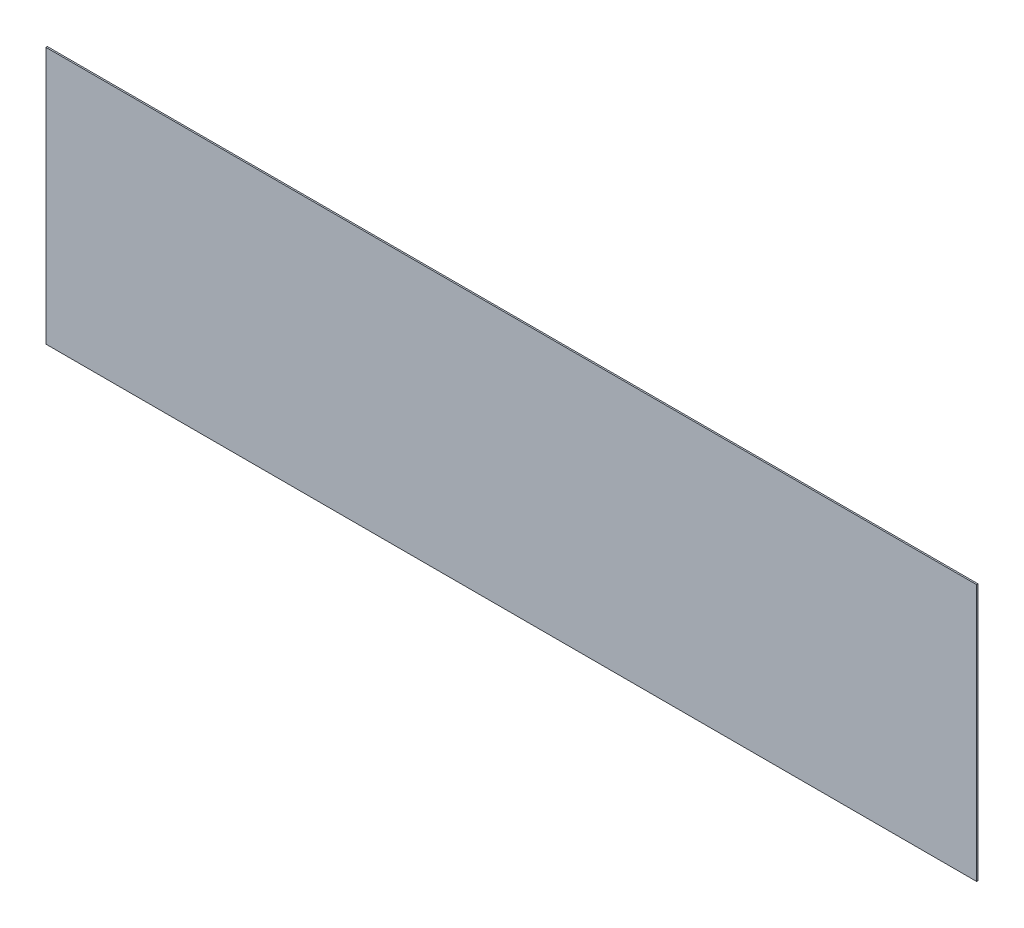
ISO-10303-21;
HEADER;
FILE_DESCRIPTION(('STEP AP214'),'2;1');
FILE_NAME('part.step','',(''),(''),'','','');
FILE_SCHEMA(('AUTOMOTIVE_DESIGN { 1 0 10303 214 1 1 1 1 }'));
ENDSEC;
DATA;
#1=APPLICATION_CONTEXT('core data for automotive mechanical design processes');
#2=APPLICATION_PROTOCOL_DEFINITION('international standard','automotive_design',2000,#1);
#3=PRODUCT_CONTEXT('',#1,'mechanical');
#4=PRODUCT('Part','Part','',(#3));
#5=PRODUCT_RELATED_PRODUCT_CATEGORY('part','',(#4));
#6=PRODUCT_DEFINITION_FORMATION('','',#4);
#7=PRODUCT_DEFINITION_CONTEXT('part definition',#1,'design');
#8=PRODUCT_DEFINITION('design','',#6,#7);
#9=PRODUCT_DEFINITION_SHAPE('','',#8);
#10=(LENGTH_UNIT() NAMED_UNIT(*) SI_UNIT(.MILLI.,.METRE.));
#11=(NAMED_UNIT(*) PLANE_ANGLE_UNIT() SI_UNIT($,.RADIAN.));
#12=(NAMED_UNIT(*) SI_UNIT($,.STERADIAN.) SOLID_ANGLE_UNIT());
#13=UNCERTAINTY_MEASURE_WITH_UNIT(LENGTH_MEASURE(1.E-05),#10,'distance_accuracy_value','');
#14=(GEOMETRIC_REPRESENTATION_CONTEXT(3) GLOBAL_UNCERTAINTY_ASSIGNED_CONTEXT((#13)) GLOBAL_UNIT_ASSIGNED_CONTEXT((#10,
#11,#12)) REPRESENTATION_CONTEXT('',''));
#15=CARTESIAN_POINT('',(0.,0.,0.));
#16=DIRECTION('',(0.,0.,1.));
#17=DIRECTION('',(1.,0.,0.));
#18=AXIS2_PLACEMENT_3D('',#15,#16,#17);
#19=CARTESIAN_POINT('',(702.,1469.,-758.5));
#20=DIRECTION('',(-1.,0.,0.));
#21=DIRECTION('',(0.,0.,1.));
#22=AXIS2_PLACEMENT_3D('',#19,#20,#21);
#23=PLANE('',#22);
#24=DIRECTION('',(0.,-1.,0.));
#25=VECTOR('',#24,1.);
#26=CARTESIAN_POINT('',(702.,1469.,-757.5));
#27=LINE('',#26,#25);
#28=CARTESIAN_POINT('',(702.,1648.,-757.5));
#29=VERTEX_POINT('',#28);
#30=CARTESIAN_POINT('',(702.,1469.,-757.5));
#31=VERTEX_POINT('',#30);
#32=EDGE_CURVE('E103',#29,#31,#27,.T.);
#33=ORIENTED_EDGE('',*,*,#32,.F.);
#34=DIRECTION('',(0.,0.,1.));
#35=VECTOR('',#34,1.);
#36=CARTESIAN_POINT('',(702.,1648.,-758.5));
#37=LINE('',#36,#35);
#38=CARTESIAN_POINT('',(702.,1648.,-758.5));
#39=VERTEX_POINT('',#38);
#40=EDGE_CURVE('E11',#39,#29,#37,.T.);
#41=ORIENTED_EDGE('',*,*,#40,.F.);
#42=DIRECTION('',(0.,-1.,0.));
#43=VECTOR('',#42,1.);
#44=CARTESIAN_POINT('',(702.,1469.,-758.5));
#45=LINE('',#44,#43);
#46=CARTESIAN_POINT('',(702.,1469.,-758.5));
#47=VERTEX_POINT('',#46);
#48=EDGE_CURVE('E97',#39,#47,#45,.T.);
#49=ORIENTED_EDGE('',*,*,#48,.T.);
#50=DIRECTION('',(0.,0.,1.));
#51=VECTOR('',#50,1.);
#52=CARTESIAN_POINT('',(702.,1469.,-758.5));
#53=LINE('',#52,#51);
#54=EDGE_CURVE('E42',#47,#31,#53,.T.);
#55=ORIENTED_EDGE('',*,*,#54,.T.);
#56=EDGE_LOOP('',(#33,#41,#49,#55));
#57=FACE_BOUND('',#56,.T.);
#58=ADVANCED_FACE('F39',(#57),#23,.T.);
#59=CARTESIAN_POINT('',(702.,1648.,-758.5));
#60=DIRECTION('',(0.,1.,0.));
#61=DIRECTION('',(0.,0.,1.));
#62=AXIS2_PLACEMENT_3D('',#59,#60,#61);
#63=PLANE('',#62);
#64=DIRECTION('',(-1.,0.,0.));
#65=VECTOR('',#64,1.);
#66=CARTESIAN_POINT('',(702.,1648.,-757.5));
#67=LINE('',#66,#65);
#68=CARTESIAN_POINT('',(1350.,1648.,-757.5));
#69=VERTEX_POINT('',#68);
#70=EDGE_CURVE('E99',#69,#29,#67,.T.);
#71=ORIENTED_EDGE('',*,*,#70,.F.);
#72=DIRECTION('',(0.,0.,1.));
#73=VECTOR('',#72,1.);
#74=CARTESIAN_POINT('',(1350.,1648.,-758.5));
#75=LINE('',#74,#73);
#76=CARTESIAN_POINT('',(1350.,1648.,-758.5));
#77=VERTEX_POINT('',#76);
#78=EDGE_CURVE('E48',#77,#69,#75,.T.);
#79=ORIENTED_EDGE('',*,*,#78,.F.);
#80=DIRECTION('',(-1.,0.,0.));
#81=VECTOR('',#80,1.);
#82=CARTESIAN_POINT('',(702.,1648.,-758.5));
#83=LINE('',#82,#81);
#84=EDGE_CURVE('E94',#77,#39,#83,.T.);
#85=ORIENTED_EDGE('',*,*,#84,.T.);
#86=ORIENTED_EDGE('',*,*,#40,.T.);
#87=EDGE_LOOP('',(#71,#79,#85,#86));
#88=FACE_BOUND('',#87,.T.);
#89=ADVANCED_FACE('F113',(#88),#63,.T.);
#90=CARTESIAN_POINT('',(1350.,1469.,-758.5));
#91=DIRECTION('',(1.,0.,0.));
#92=DIRECTION('',(0.,0.,-1.));
#93=AXIS2_PLACEMENT_3D('',#90,#91,#92);
#94=PLANE('',#93);
#95=DIRECTION('',(0.,1.,0.));
#96=VECTOR('',#95,1.);
#97=CARTESIAN_POINT('',(1350.,1469.,-757.5));
#98=LINE('',#97,#96);
#99=CARTESIAN_POINT('',(1350.,1469.,-757.5));
#100=VERTEX_POINT('',#99);
#101=EDGE_CURVE('E89',#100,#69,#98,.T.);
#102=ORIENTED_EDGE('',*,*,#101,.F.);
#103=DIRECTION('',(0.,0.,1.));
#104=VECTOR('',#103,1.);
#105=CARTESIAN_POINT('',(1350.,1469.,-758.5));
#106=LINE('',#105,#104);
#107=CARTESIAN_POINT('',(1350.,1469.,-758.5));
#108=VERTEX_POINT('',#107);
#109=EDGE_CURVE('E84',#108,#100,#106,.T.);
#110=ORIENTED_EDGE('',*,*,#109,.F.);
#111=DIRECTION('',(0.,1.,0.));
#112=VECTOR('',#111,1.);
#113=CARTESIAN_POINT('',(1350.,1469.,-758.5));
#114=LINE('',#113,#112);
#115=EDGE_CURVE('E87',#108,#77,#114,.T.);
#116=ORIENTED_EDGE('',*,*,#115,.T.);
#117=ORIENTED_EDGE('',*,*,#78,.T.);
#118=EDGE_LOOP('',(#102,#110,#116,#117));
#119=FACE_BOUND('',#118,.T.);
#120=ADVANCED_FACE('F86',(#119),#94,.T.);
#121=CARTESIAN_POINT('',(702.,1469.,-758.5));
#122=DIRECTION('',(0.,-1.,0.));
#123=DIRECTION('',(0.,0.,-1.));
#124=AXIS2_PLACEMENT_3D('',#121,#122,#123);
#125=PLANE('',#124);
#126=DIRECTION('',(1.,0.,0.));
#127=VECTOR('',#126,1.);
#128=CARTESIAN_POINT('',(702.,1469.,-757.5));
#129=LINE('',#128,#127);
#130=EDGE_CURVE('E106',#31,#100,#129,.T.);
#131=ORIENTED_EDGE('',*,*,#130,.F.);
#132=ORIENTED_EDGE('',*,*,#54,.F.);
#133=DIRECTION('',(1.,0.,0.));
#134=VECTOR('',#133,1.);
#135=CARTESIAN_POINT('',(702.,1469.,-758.5));
#136=LINE('',#135,#134);
#137=EDGE_CURVE('E93',#47,#108,#136,.T.);
#138=ORIENTED_EDGE('',*,*,#137,.T.);
#139=ORIENTED_EDGE('',*,*,#109,.T.);
#140=EDGE_LOOP('',(#131,#132,#138,#139));
#141=FACE_BOUND('',#140,.T.);
#142=ADVANCED_FACE('F96',(#141),#125,.T.);
#143=CARTESIAN_POINT('',(0.,0.,-758.5));
#144=DIRECTION('',(0.,0.,-1.));
#145=DIRECTION('',(-1.,0.,0.));
#146=AXIS2_PLACEMENT_3D('',#143,#144,#145);
#147=PLANE('',#146);
#148=ORIENTED_EDGE('',*,*,#48,.F.);
#149=ORIENTED_EDGE('',*,*,#84,.F.);
#150=ORIENTED_EDGE('',*,*,#115,.F.);
#151=ORIENTED_EDGE('',*,*,#137,.F.);
#152=EDGE_LOOP('',(#148,#149,#150,#151));
#153=FACE_BOUND('',#152,.T.);
#154=ADVANCED_FACE('F92',(#153),#147,.T.);
#155=CARTESIAN_POINT('',(0.,0.,-757.5));
#156=DIRECTION('',(0.,0.,-1.));
#157=DIRECTION('',(-1.,0.,0.));
#158=AXIS2_PLACEMENT_3D('',#155,#156,#157);
#159=PLANE('',#158);
#160=ORIENTED_EDGE('',*,*,#32,.T.);
#161=ORIENTED_EDGE('',*,*,#130,.T.);
#162=ORIENTED_EDGE('',*,*,#101,.T.);
#163=ORIENTED_EDGE('',*,*,#70,.T.);
#164=EDGE_LOOP('',(#160,#161,#162,#163));
#165=FACE_BOUND('',#164,.T.);
#166=ADVANCED_FACE('F112',(#165),#159,.F.);
#167=CLOSED_SHELL('',(#58,#89,#120,#142,#154,#166));
#168=MANIFOLD_SOLID_BREP('B2',#167);
#169=ADVANCED_BREP_SHAPE_REPRESENTATION('',(#18,#168),#14);
#170=SHAPE_DEFINITION_REPRESENTATION(#9,#169);
ENDSEC;
END-ISO-10303-21;
